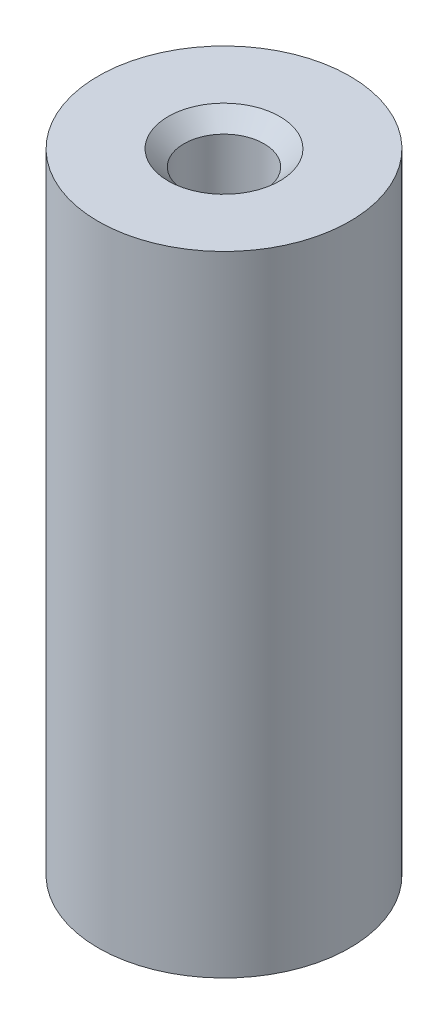
ISO-10303-21;
HEADER;
FILE_DESCRIPTION(('STEP AP214'),'2;1');
FILE_NAME('part.step','',(''),(''),'','','');
FILE_SCHEMA(('AUTOMOTIVE_DESIGN { 1 0 10303 214 1 1 1 1 }'));
ENDSEC;
DATA;
#1=APPLICATION_CONTEXT('core data for automotive mechanical design processes');
#2=APPLICATION_PROTOCOL_DEFINITION('international standard','automotive_design',2000,#1);
#3=PRODUCT_CONTEXT('',#1,'mechanical');
#4=PRODUCT('Part','Part','',(#3));
#5=PRODUCT_RELATED_PRODUCT_CATEGORY('part','',(#4));
#6=PRODUCT_DEFINITION_FORMATION('','',#4);
#7=PRODUCT_DEFINITION_CONTEXT('part definition',#1,'design');
#8=PRODUCT_DEFINITION('design','',#6,#7);
#9=PRODUCT_DEFINITION_SHAPE('','',#8);
#10=(LENGTH_UNIT() NAMED_UNIT(*) SI_UNIT(.MILLI.,.METRE.));
#11=(NAMED_UNIT(*) PLANE_ANGLE_UNIT() SI_UNIT($,.RADIAN.));
#12=(NAMED_UNIT(*) SI_UNIT($,.STERADIAN.) SOLID_ANGLE_UNIT());
#13=UNCERTAINTY_MEASURE_WITH_UNIT(LENGTH_MEASURE(1.E-05),#10,'distance_accuracy_value','');
#14=(GEOMETRIC_REPRESENTATION_CONTEXT(3) GLOBAL_UNCERTAINTY_ASSIGNED_CONTEXT((#13)) GLOBAL_UNIT_ASSIGNED_CONTEXT((#10,
#11,#12)) REPRESENTATION_CONTEXT('',''));
#15=CARTESIAN_POINT('',(0.,0.,0.));
#16=DIRECTION('',(0.,0.,1.));
#17=DIRECTION('',(1.,0.,0.));
#18=AXIS2_PLACEMENT_3D('',#15,#16,#17);
#19=CARTESIAN_POINT('',(0.,20.,0.));
#20=DIRECTION('',(0.,-1.,0.));
#21=DIRECTION('',(0.,0.,-1.));
#22=AXIS2_PLACEMENT_3D('',#19,#20,#21);
#23=CYLINDRICAL_SURFACE('',#22,4.);
#24=CARTESIAN_POINT('',(0.,20.,0.));
#25=DIRECTION('',(0.,1.,0.));
#26=DIRECTION('',(0.,0.,1.));
#27=AXIS2_PLACEMENT_3D('',#24,#25,#26);
#28=CIRCLE('',#27,4.);
#29=CARTESIAN_POINT('',(0.,20.,4.));
#30=VERTEX_POINT('',#29);
#31=EDGE_CURVE('E86',#30,#30,#28,.T.);
#32=ORIENTED_EDGE('',*,*,#31,.F.);
#33=EDGE_LOOP('',(#32));
#34=FACE_BOUND('',#33,.T.);
#35=CARTESIAN_POINT('',(0.,0.,0.));
#36=DIRECTION('',(0.,1.,0.));
#37=DIRECTION('',(0.,0.,1.));
#38=AXIS2_PLACEMENT_3D('',#35,#36,#37);
#39=CIRCLE('',#38,4.);
#40=CARTESIAN_POINT('',(0.,0.,4.));
#41=VERTEX_POINT('',#40);
#42=EDGE_CURVE('E87',#41,#41,#39,.T.);
#43=ORIENTED_EDGE('',*,*,#42,.T.);
#44=EDGE_LOOP('',(#43));
#45=FACE_BOUND('',#44,.T.);
#46=ADVANCED_FACE('F45',(#34,#45),#23,.T.);
#47=CARTESIAN_POINT('',(0.,20.,0.));
#48=DIRECTION('',(0.,1.,0.));
#49=DIRECTION('',(0.,0.,1.));
#50=AXIS2_PLACEMENT_3D('',#47,#48,#49);
#51=PLANE('',#50);
#52=CARTESIAN_POINT('',(0.,20.,0.));
#53=DIRECTION('',(0.,1.,0.));
#54=DIRECTION('',(0.,0.,1.));
#55=AXIS2_PLACEMENT_3D('',#52,#53,#54);
#56=CIRCLE('',#55,1.77500000000001);
#57=CARTESIAN_POINT('',(0.,20.,1.77500000000001));
#58=VERTEX_POINT('',#57);
#59=EDGE_CURVE('E64',#58,#58,#56,.F.);
#60=ORIENTED_EDGE('',*,*,#59,.T.);
#61=EDGE_LOOP('',(#60));
#62=FACE_BOUND('',#61,.T.);
#63=ORIENTED_EDGE('',*,*,#31,.T.);
#64=EDGE_LOOP('',(#63));
#65=FACE_BOUND('',#64,.T.);
#66=ADVANCED_FACE('F95',(#62,#65),#51,.T.);
#67=CARTESIAN_POINT('',(0.,0.,0.));
#68=DIRECTION('',(0.,1.,0.));
#69=DIRECTION('',(0.,0.,1.));
#70=AXIS2_PLACEMENT_3D('',#67,#68,#69);
#71=PLANE('',#70);
#72=CARTESIAN_POINT('',(0.,0.,0.));
#73=DIRECTION('',(0.,1.,0.));
#74=DIRECTION('',(0.,0.,1.));
#75=AXIS2_PLACEMENT_3D('',#72,#73,#74);
#76=CIRCLE('',#75,2.95000000000001);
#77=CARTESIAN_POINT('',(0.,0.,2.95000000000001));
#78=VERTEX_POINT('',#77);
#79=EDGE_CURVE('E74',#78,#78,#76,.T.);
#80=ORIENTED_EDGE('',*,*,#79,.T.);
#81=EDGE_LOOP('',(#80));
#82=FACE_BOUND('',#81,.T.);
#83=ORIENTED_EDGE('',*,*,#42,.F.);
#84=EDGE_LOOP('',(#83));
#85=FACE_BOUND('',#84,.T.);
#86=ADVANCED_FACE('F102',(#82,#85),#71,.F.);
#87=CARTESIAN_POINT('',(0.,6.,0.));
#88=DIRECTION('',(0.,-1.,0.));
#89=DIRECTION('',(0.,0.,-1.));
#90=AXIS2_PLACEMENT_3D('',#87,#88,#89);
#91=CYLINDRICAL_SURFACE('',#90,2.45);
#92=CARTESIAN_POINT('',(0.,5.5,0.));
#93=DIRECTION('',(0.,-1.,0.));
#94=DIRECTION('',(0.,0.,-1.));
#95=AXIS2_PLACEMENT_3D('',#92,#93,#94);
#96=CIRCLE('',#95,2.45);
#97=CARTESIAN_POINT('',(0.,5.5,-2.45));
#98=VERTEX_POINT('',#97);
#99=EDGE_CURVE('E78',#98,#98,#96,.F.);
#100=ORIENTED_EDGE('',*,*,#99,.T.);
#101=EDGE_LOOP('',(#100));
#102=FACE_BOUND('',#101,.T.);
#103=CARTESIAN_POINT('',(0.,0.500000000000006,0.));
#104=DIRECTION('',(0.,1.,0.));
#105=DIRECTION('',(0.,0.,1.));
#106=AXIS2_PLACEMENT_3D('',#103,#104,#105);
#107=CIRCLE('',#106,2.45);
#108=CARTESIAN_POINT('',(0.,0.500000000000006,2.45));
#109=VERTEX_POINT('',#108);
#110=EDGE_CURVE('E82',#109,#109,#107,.F.);
#111=ORIENTED_EDGE('',*,*,#110,.T.);
#112=EDGE_LOOP('',(#111));
#113=FACE_BOUND('',#112,.T.);
#114=ADVANCED_FACE('F104',(#102,#113),#91,.F.);
#115=CARTESIAN_POINT('',(0.,16.,0.));
#116=DIRECTION('',(0.,-1.,0.));
#117=DIRECTION('',(0.,0.,-1.));
#118=AXIS2_PLACEMENT_3D('',#115,#116,#117);
#119=CYLINDRICAL_SURFACE('',#118,2.7);
#120=CARTESIAN_POINT('',(0.,16.075,0.));
#121=DIRECTION('',(0.,-1.,0.));
#122=DIRECTION('',(0.,0.,-1.));
#123=AXIS2_PLACEMENT_3D('',#120,#121,#122);
#124=CIRCLE('',#123,2.7);
#125=CARTESIAN_POINT('',(0.,16.075,-2.7));
#126=VERTEX_POINT('',#125);
#127=EDGE_CURVE('E10',#126,#126,#124,.F.);
#128=ORIENTED_EDGE('',*,*,#127,.T.);
#129=EDGE_LOOP('',(#128));
#130=FACE_BOUND('',#129,.T.);
#131=CARTESIAN_POINT('',(0.,5.74999999999999,0.));
#132=DIRECTION('',(0.,1.,0.));
#133=DIRECTION('',(0.,0.,1.));
#134=AXIS2_PLACEMENT_3D('',#131,#132,#133);
#135=CIRCLE('',#134,2.7);
#136=CARTESIAN_POINT('',(0.,5.74999999999999,2.7));
#137=VERTEX_POINT('',#136);
#138=EDGE_CURVE('E59',#137,#137,#135,.F.);
#139=ORIENTED_EDGE('',*,*,#138,.T.);
#140=EDGE_LOOP('',(#139));
#141=FACE_BOUND('',#140,.T.);
#142=ADVANCED_FACE('F111',(#130,#141),#119,.F.);
#143=CARTESIAN_POINT('',(0.,22.,0.));
#144=DIRECTION('',(0.,-1.,0.));
#145=DIRECTION('',(0.,0.,-1.));
#146=AXIS2_PLACEMENT_3D('',#143,#144,#145);
#147=CYLINDRICAL_SURFACE('',#146,1.275);
#148=CARTESIAN_POINT('',(0.,17.5,0.));
#149=DIRECTION('',(0.,-1.,0.));
#150=DIRECTION('',(0.,0.,-1.));
#151=AXIS2_PLACEMENT_3D('',#148,#149,#150);
#152=CIRCLE('',#151,1.275);
#153=CARTESIAN_POINT('',(0.,17.5,-1.275));
#154=VERTEX_POINT('',#153);
#155=EDGE_CURVE('E54',#154,#154,#152,.T.);
#156=ORIENTED_EDGE('',*,*,#155,.T.);
#157=EDGE_LOOP('',(#156));
#158=FACE_BOUND('',#157,.T.);
#159=CARTESIAN_POINT('',(0.,19.5,0.));
#160=DIRECTION('',(0.,1.,0.));
#161=DIRECTION('',(0.,0.,1.));
#162=AXIS2_PLACEMENT_3D('',#159,#160,#161);
#163=CIRCLE('',#162,1.275);
#164=CARTESIAN_POINT('',(0.,19.5,1.275));
#165=VERTEX_POINT('',#164);
#166=EDGE_CURVE('E70',#165,#165,#163,.T.);
#167=ORIENTED_EDGE('',*,*,#166,.T.);
#168=EDGE_LOOP('',(#167));
#169=FACE_BOUND('',#168,.T.);
#170=ADVANCED_FACE('F125',(#158,#169),#147,.F.);
#171=CARTESIAN_POINT('',(0.,6.,0.));
#172=DIRECTION('',(0.,1.,0.));
#173=DIRECTION('',(0.,0.,1.));
#174=AXIS2_PLACEMENT_3D('',#171,#172,#173);
#175=CONICAL_SURFACE('',#174,2.95000000000001,0.785398163397453);
#176=ORIENTED_EDGE('',*,*,#99,.F.);
#177=EDGE_LOOP('',(#176));
#178=FACE_BOUND('',#177,.T.);
#179=ORIENTED_EDGE('',*,*,#138,.F.);
#180=EDGE_LOOP('',(#179));
#181=FACE_BOUND('',#180,.T.);
#182=ADVANCED_FACE('F118',(#178,#181),#175,.F.);
#183=CARTESIAN_POINT('',(0.,0.500000000000006,0.));
#184=DIRECTION('',(0.,-1.,0.));
#185=DIRECTION('',(0.,0.,-1.));
#186=AXIS2_PLACEMENT_3D('',#183,#184,#185);
#187=CONICAL_SURFACE('',#186,2.45,0.78539816339745);
#188=ORIENTED_EDGE('',*,*,#79,.F.);
#189=EDGE_LOOP('',(#188));
#190=FACE_BOUND('',#189,.T.);
#191=ORIENTED_EDGE('',*,*,#110,.F.);
#192=EDGE_LOOP('',(#191));
#193=FACE_BOUND('',#192,.T.);
#194=ADVANCED_FACE('F124',(#190,#193),#187,.F.);
#195=CARTESIAN_POINT('',(0.,19.5,0.));
#196=DIRECTION('',(0.,1.,0.));
#197=DIRECTION('',(0.,0.,1.));
#198=AXIS2_PLACEMENT_3D('',#195,#196,#197);
#199=CONICAL_SURFACE('',#198,1.275,0.785398163397457);
#200=ORIENTED_EDGE('',*,*,#59,.F.);
#201=EDGE_LOOP('',(#200));
#202=FACE_BOUND('',#201,.T.);
#203=ORIENTED_EDGE('',*,*,#166,.F.);
#204=EDGE_LOOP('',(#203));
#205=FACE_BOUND('',#204,.T.);
#206=ADVANCED_FACE('F131',(#202,#205),#199,.F.);
#207=CARTESIAN_POINT('',(0.,17.5,0.));
#208=DIRECTION('',(0.,-1.,0.));
#209=DIRECTION('',(0.,0.,-1.));
#210=AXIS2_PLACEMENT_3D('',#207,#208,#209);
#211=CONICAL_SURFACE('',#210,1.275,0.785398163397443);
#212=ORIENTED_EDGE('',*,*,#127,.F.);
#213=EDGE_LOOP('',(#212));
#214=FACE_BOUND('',#213,.T.);
#215=ORIENTED_EDGE('',*,*,#155,.F.);
#216=EDGE_LOOP('',(#215));
#217=FACE_BOUND('',#216,.T.);
#218=ADVANCED_FACE('F48',(#214,#217),#211,.F.);
#219=CLOSED_SHELL('',(#46,#66,#86,#114,#142,#170,#182,#194,#206,#218));
#220=MANIFOLD_SOLID_BREP('B2',#219);
#221=ADVANCED_BREP_SHAPE_REPRESENTATION('',(#18,#220),#14);
#222=SHAPE_DEFINITION_REPRESENTATION(#9,#221);
ENDSEC;
END-ISO-10303-21;
